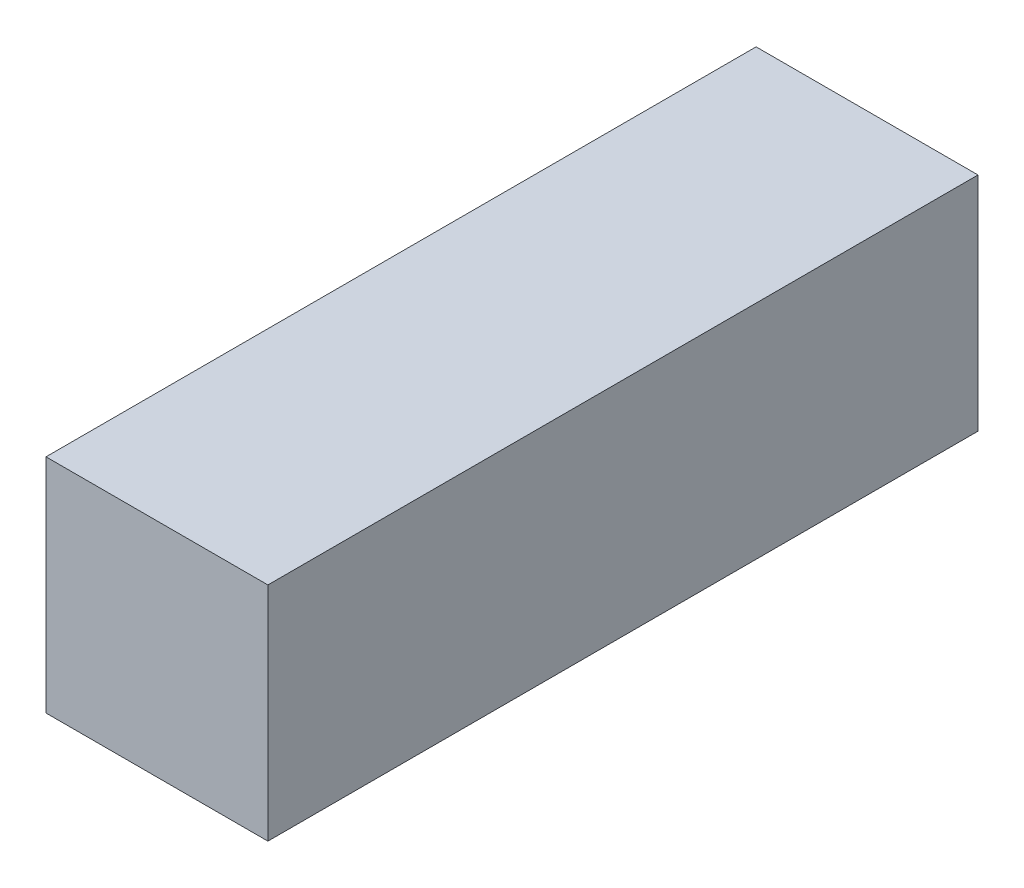
ISO-10303-21;
HEADER;
FILE_DESCRIPTION(('STEP AP214'),'2;1');
FILE_NAME('part.step','',(''),(''),'','','');
FILE_SCHEMA(('AUTOMOTIVE_DESIGN { 1 0 10303 214 1 1 1 1 }'));
ENDSEC;
DATA;
#1=APPLICATION_CONTEXT('core data for automotive mechanical design processes');
#2=APPLICATION_PROTOCOL_DEFINITION('international standard','automotive_design',2000,#1);
#3=PRODUCT_CONTEXT('',#1,'mechanical');
#4=PRODUCT('Part','Part','',(#3));
#5=PRODUCT_RELATED_PRODUCT_CATEGORY('part','',(#4));
#6=PRODUCT_DEFINITION_FORMATION('','',#4);
#7=PRODUCT_DEFINITION_CONTEXT('part definition',#1,'design');
#8=PRODUCT_DEFINITION('design','',#6,#7);
#9=PRODUCT_DEFINITION_SHAPE('','',#8);
#10=(LENGTH_UNIT() NAMED_UNIT(*) SI_UNIT(.MILLI.,.METRE.));
#11=(NAMED_UNIT(*) PLANE_ANGLE_UNIT() SI_UNIT($,.RADIAN.));
#12=(NAMED_UNIT(*) SI_UNIT($,.STERADIAN.) SOLID_ANGLE_UNIT());
#13=UNCERTAINTY_MEASURE_WITH_UNIT(LENGTH_MEASURE(1.E-05),#10,'distance_accuracy_value','');
#14=(GEOMETRIC_REPRESENTATION_CONTEXT(3) GLOBAL_UNCERTAINTY_ASSIGNED_CONTEXT((#13)) GLOBAL_UNIT_ASSIGNED_CONTEXT((#10,
#11,#12)) REPRESENTATION_CONTEXT('',''));
#15=CARTESIAN_POINT('',(0.,0.,0.));
#16=DIRECTION('',(0.,0.,1.));
#17=DIRECTION('',(1.,0.,0.));
#18=AXIS2_PLACEMENT_3D('',#15,#16,#17);
#19=CARTESIAN_POINT('',(-0.2499995,-0.2499995,0.));
#20=DIRECTION('',(-1.,0.,0.));
#21=DIRECTION('',(0.,0.,1.));
#22=AXIS2_PLACEMENT_3D('',#19,#20,#21);
#23=PLANE('',#22);
#24=DIRECTION('',(0.,0.,1.));
#25=VECTOR('',#24,1.);
#26=CARTESIAN_POINT('',(-0.2499995,0.2499995,0.));
#27=LINE('',#26,#25);
#28=CARTESIAN_POINT('',(-0.2499995,0.2499995,0.));
#29=VERTEX_POINT('',#28);
#30=CARTESIAN_POINT('',(-0.2499995,0.2499995,1.59999934));
#31=VERTEX_POINT('',#30);
#32=EDGE_CURVE('E62',#29,#31,#27,.T.);
#33=ORIENTED_EDGE('',*,*,#32,.F.);
#34=DIRECTION('',(0.,1.,0.));
#35=VECTOR('',#34,1.);
#36=CARTESIAN_POINT('',(-0.2499995,-0.2499995,0.));
#37=LINE('',#36,#35);
#38=CARTESIAN_POINT('',(-0.2499995,-0.2499995,0.));
#39=VERTEX_POINT('',#38);
#40=EDGE_CURVE('E20',#29,#39,#37,.F.);
#41=ORIENTED_EDGE('',*,*,#40,.T.);
#42=DIRECTION('',(0.,0.,-1.));
#43=VECTOR('',#42,1.);
#44=CARTESIAN_POINT('',(-0.2499995,-0.2499995,0.));
#45=LINE('',#44,#43);
#46=CARTESIAN_POINT('',(-0.2499995,-0.2499995,1.59999934));
#47=VERTEX_POINT('',#46);
#48=EDGE_CURVE('E69',#47,#39,#45,.T.);
#49=ORIENTED_EDGE('',*,*,#48,.F.);
#50=DIRECTION('',(0.,1.,0.));
#51=VECTOR('',#50,1.);
#52=CARTESIAN_POINT('',(-0.2499995,0.2499995,1.59999934));
#53=LINE('',#52,#51);
#54=EDGE_CURVE('E56',#31,#47,#53,.F.);
#55=ORIENTED_EDGE('',*,*,#54,.F.);
#56=EDGE_LOOP('',(#33,#41,#49,#55));
#57=FACE_BOUND('',#56,.T.);
#58=ADVANCED_FACE('F17',(#57),#23,.T.);
#59=CARTESIAN_POINT('',(-0.2499995,0.2499995,0.));
#60=DIRECTION('',(0.,1.,0.));
#61=DIRECTION('',(0.,0.,1.));
#62=AXIS2_PLACEMENT_3D('',#59,#60,#61);
#63=PLANE('',#62);
#64=DIRECTION('',(0.,0.,-1.));
#65=VECTOR('',#64,1.);
#66=CARTESIAN_POINT('',(0.2499995,0.2499995,0.));
#67=LINE('',#66,#65);
#68=CARTESIAN_POINT('',(0.2499995,0.2499995,0.));
#69=VERTEX_POINT('',#68);
#70=CARTESIAN_POINT('',(0.2499995,0.2499995,1.59999934));
#71=VERTEX_POINT('',#70);
#72=EDGE_CURVE('E83',#69,#71,#67,.F.);
#73=ORIENTED_EDGE('',*,*,#72,.F.);
#74=DIRECTION('',(1.,0.,0.));
#75=VECTOR('',#74,1.);
#76=CARTESIAN_POINT('',(0.2499995,0.2499995,0.));
#77=LINE('',#76,#75);
#78=EDGE_CURVE('E67',#69,#29,#77,.F.);
#79=ORIENTED_EDGE('',*,*,#78,.T.);
#80=ORIENTED_EDGE('',*,*,#32,.T.);
#81=DIRECTION('',(1.,0.,0.));
#82=VECTOR('',#81,1.);
#83=CARTESIAN_POINT('',(0.2499995,0.2499995,1.59999934));
#84=LINE('',#83,#82);
#85=EDGE_CURVE('E64',#71,#31,#84,.F.);
#86=ORIENTED_EDGE('',*,*,#85,.F.);
#87=EDGE_LOOP('',(#73,#79,#80,#86));
#88=FACE_BOUND('',#87,.T.);
#89=ADVANCED_FACE('F63',(#88),#63,.T.);
#90=CARTESIAN_POINT('',(0.2499995,0.2499995,1.59999934));
#91=DIRECTION('',(0.,0.,1.));
#92=DIRECTION('',(1.,0.,0.));
#93=AXIS2_PLACEMENT_3D('',#90,#91,#92);
#94=PLANE('',#93);
#95=DIRECTION('',(1.,0.,0.));
#96=VECTOR('',#95,1.);
#97=CARTESIAN_POINT('',(0.2499995,-0.2499995,1.59999934));
#98=LINE('',#97,#96);
#99=CARTESIAN_POINT('',(0.2499995,-0.2499995,1.59999934));
#100=VERTEX_POINT('',#99);
#101=EDGE_CURVE('E71',#100,#47,#98,.F.);
#102=ORIENTED_EDGE('',*,*,#101,.F.);
#103=DIRECTION('',(0.,1.,0.));
#104=VECTOR('',#103,1.);
#105=CARTESIAN_POINT('',(0.2499995,0.2499995,1.59999934));
#106=LINE('',#105,#104);
#107=EDGE_CURVE('E75',#71,#100,#106,.F.);
#108=ORIENTED_EDGE('',*,*,#107,.F.);
#109=ORIENTED_EDGE('',*,*,#85,.T.);
#110=ORIENTED_EDGE('',*,*,#54,.T.);
#111=EDGE_LOOP('',(#102,#108,#109,#110));
#112=FACE_BOUND('',#111,.T.);
#113=ADVANCED_FACE('F73',(#112),#94,.T.);
#114=CARTESIAN_POINT('',(0.2499995,-0.2499995,0.));
#115=DIRECTION('',(0.,-1.,0.));
#116=DIRECTION('',(0.,0.,-1.));
#117=AXIS2_PLACEMENT_3D('',#114,#115,#116);
#118=PLANE('',#117);
#119=ORIENTED_EDGE('',*,*,#48,.T.);
#120=DIRECTION('',(1.,0.,0.));
#121=VECTOR('',#120,1.);
#122=CARTESIAN_POINT('',(0.2499995,-0.2499995,0.));
#123=LINE('',#122,#121);
#124=CARTESIAN_POINT('',(0.2499995,-0.2499995,0.));
#125=VERTEX_POINT('',#124);
#126=EDGE_CURVE('E35',#39,#125,#123,.T.);
#127=ORIENTED_EDGE('',*,*,#126,.T.);
#128=DIRECTION('',(0.,0.,-1.));
#129=VECTOR('',#128,1.);
#130=CARTESIAN_POINT('',(0.2499995,-0.2499995,0.));
#131=LINE('',#130,#129);
#132=EDGE_CURVE('E26',#100,#125,#131,.T.);
#133=ORIENTED_EDGE('',*,*,#132,.F.);
#134=ORIENTED_EDGE('',*,*,#101,.T.);
#135=EDGE_LOOP('',(#119,#127,#133,#134));
#136=FACE_BOUND('',#135,.T.);
#137=ADVANCED_FACE('F89',(#136),#118,.T.);
#138=CARTESIAN_POINT('',(0.2499995,0.2499995,0.));
#139=DIRECTION('',(0.,0.,1.));
#140=DIRECTION('',(1.,0.,0.));
#141=AXIS2_PLACEMENT_3D('',#138,#139,#140);
#142=PLANE('',#141);
#143=ORIENTED_EDGE('',*,*,#126,.F.);
#144=ORIENTED_EDGE('',*,*,#40,.F.);
#145=ORIENTED_EDGE('',*,*,#78,.F.);
#146=DIRECTION('',(0.,1.,0.));
#147=VECTOR('',#146,1.);
#148=CARTESIAN_POINT('',(0.2499995,0.2499995,0.));
#149=LINE('',#148,#147);
#150=EDGE_CURVE('E11',#125,#69,#149,.T.);
#151=ORIENTED_EDGE('',*,*,#150,.F.);
#152=EDGE_LOOP('',(#143,#144,#145,#151));
#153=FACE_BOUND('',#152,.T.);
#154=ADVANCED_FACE('F91',(#153),#142,.F.);
#155=CARTESIAN_POINT('',(0.2499995,0.2499995,0.));
#156=DIRECTION('',(1.,0.,0.));
#157=DIRECTION('',(0.,0.,-1.));
#158=AXIS2_PLACEMENT_3D('',#155,#156,#157);
#159=PLANE('',#158);
#160=ORIENTED_EDGE('',*,*,#132,.T.);
#161=ORIENTED_EDGE('',*,*,#150,.T.);
#162=ORIENTED_EDGE('',*,*,#72,.T.);
#163=ORIENTED_EDGE('',*,*,#107,.T.);
#164=EDGE_LOOP('',(#160,#161,#162,#163));
#165=FACE_BOUND('',#164,.T.);
#166=ADVANCED_FACE('F88',(#165),#159,.T.);
#167=CLOSED_SHELL('',(#58,#89,#113,#137,#154,#166));
#168=MANIFOLD_SOLID_BREP('B1',#167);
#169=ADVANCED_BREP_SHAPE_REPRESENTATION('',(#18,#168),#14);
#170=SHAPE_DEFINITION_REPRESENTATION(#9,#169);
ENDSEC;
END-ISO-10303-21;
